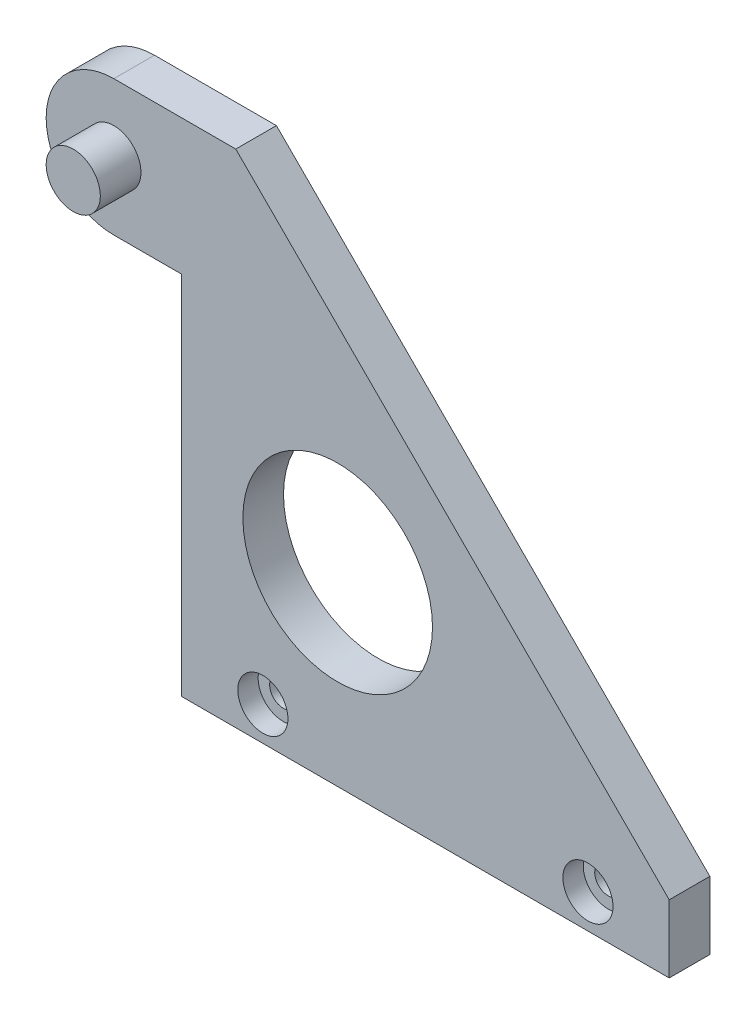
ISO-10303-21;
HEADER;
FILE_DESCRIPTION(('STEP AP214'),'2;1');
FILE_NAME('part.step','',(''),(''),'','','');
FILE_SCHEMA(('AUTOMOTIVE_DESIGN { 1 0 10303 214 1 1 1 1 }'));
ENDSEC;
DATA;
#1=APPLICATION_CONTEXT('core data for automotive mechanical design processes');
#2=APPLICATION_PROTOCOL_DEFINITION('international standard','automotive_design',2000,#1);
#3=PRODUCT_CONTEXT('',#1,'mechanical');
#4=PRODUCT('Part','Part','',(#3));
#5=PRODUCT_RELATED_PRODUCT_CATEGORY('part','',(#4));
#6=PRODUCT_DEFINITION_FORMATION('','',#4);
#7=PRODUCT_DEFINITION_CONTEXT('part definition',#1,'design');
#8=PRODUCT_DEFINITION('design','',#6,#7);
#9=PRODUCT_DEFINITION_SHAPE('','',#8);
#10=(LENGTH_UNIT() NAMED_UNIT(*) SI_UNIT(.MILLI.,.METRE.));
#11=(NAMED_UNIT(*) PLANE_ANGLE_UNIT() SI_UNIT($,.RADIAN.));
#12=(NAMED_UNIT(*) SI_UNIT($,.STERADIAN.) SOLID_ANGLE_UNIT());
#13=UNCERTAINTY_MEASURE_WITH_UNIT(LENGTH_MEASURE(1.E-05),#10,'distance_accuracy_value','');
#14=(GEOMETRIC_REPRESENTATION_CONTEXT(3) GLOBAL_UNCERTAINTY_ASSIGNED_CONTEXT((#13)) GLOBAL_UNIT_ASSIGNED_CONTEXT((#10,
#11,#12)) REPRESENTATION_CONTEXT('',''));
#15=CARTESIAN_POINT('',(0.,0.,0.));
#16=DIRECTION('',(0.,0.,1.));
#17=DIRECTION('',(1.,0.,0.));
#18=AXIS2_PLACEMENT_3D('',#15,#16,#17);
#19=CARTESIAN_POINT('',(-12.,2.49999999999995,0.));
#20=DIRECTION('',(0.,0.,1.));
#21=DIRECTION('',(1.,0.,0.));
#22=AXIS2_PLACEMENT_3D('',#19,#20,#21);
#23=CYLINDRICAL_SURFACE('',#22,1.);
#24=CARTESIAN_POINT('',(-12.,2.49999999999995,0.));
#25=DIRECTION('',(0.,0.,1.));
#26=DIRECTION('',(-1.,0.,0.));
#27=AXIS2_PLACEMENT_3D('',#24,#25,#26);
#28=CIRCLE('',#27,1.);
#29=CARTESIAN_POINT('',(-13.,2.49999999999995,0.));
#30=VERTEX_POINT('',#29);
#31=EDGE_CURVE('E140',#30,#30,#28,.T.);
#32=ORIENTED_EDGE('',*,*,#31,.F.);
#33=EDGE_LOOP('',(#32));
#34=FACE_BOUND('',#33,.T.);
#35=CARTESIAN_POINT('',(-12.,2.49999999999995,1.5));
#36=DIRECTION('',(0.,0.,1.));
#37=DIRECTION('',(1.,0.,0.));
#38=AXIS2_PLACEMENT_3D('',#35,#36,#37);
#39=CIRCLE('',#38,1.);
#40=CARTESIAN_POINT('',(-11.,2.49999999999995,1.5));
#41=VERTEX_POINT('',#40);
#42=EDGE_CURVE('E46',#41,#41,#39,.F.);
#43=ORIENTED_EDGE('',*,*,#42,.F.);
#44=EDGE_LOOP('',(#43));
#45=FACE_BOUND('',#44,.T.);
#46=ADVANCED_FACE('F41',(#34,#45),#23,.F.);
#47=CARTESIAN_POINT('',(12.,2.49999999999995,0.));
#48=DIRECTION('',(0.,0.,1.));
#49=DIRECTION('',(1.,0.,0.));
#50=AXIS2_PLACEMENT_3D('',#47,#48,#49);
#51=CYLINDRICAL_SURFACE('',#50,1.);
#52=CARTESIAN_POINT('',(12.,2.49999999999995,0.));
#53=DIRECTION('',(0.,0.,1.));
#54=DIRECTION('',(1.,0.,0.));
#55=AXIS2_PLACEMENT_3D('',#52,#53,#54);
#56=CIRCLE('',#55,1.);
#57=CARTESIAN_POINT('',(13.,2.49999999999995,0.));
#58=VERTEX_POINT('',#57);
#59=EDGE_CURVE('E155',#58,#58,#56,.T.);
#60=ORIENTED_EDGE('',*,*,#59,.F.);
#61=EDGE_LOOP('',(#60));
#62=FACE_BOUND('',#61,.T.);
#63=CARTESIAN_POINT('',(12.,2.49999999999995,1.5));
#64=DIRECTION('',(0.,0.,1.));
#65=DIRECTION('',(1.,0.,0.));
#66=AXIS2_PLACEMENT_3D('',#63,#64,#65);
#67=CIRCLE('',#66,1.);
#68=CARTESIAN_POINT('',(13.,2.49999999999995,1.5));
#69=VERTEX_POINT('',#68);
#70=EDGE_CURVE('E133',#69,#69,#67,.F.);
#71=ORIENTED_EDGE('',*,*,#70,.F.);
#72=EDGE_LOOP('',(#71));
#73=FACE_BOUND('',#72,.T.);
#74=ADVANCED_FACE('F217',(#62,#73),#51,.F.);
#75=CARTESIAN_POINT('',(-23.,32.,0.));
#76=DIRECTION('',(0.,0.,-1.));
#77=DIRECTION('',(-1.,0.,0.));
#78=AXIS2_PLACEMENT_3D('',#75,#76,#77);
#79=CYLINDRICAL_SURFACE('',#78,5.);
#80=DIRECTION('',(0.,0.,-1.));
#81=VECTOR('',#80,1.);
#82=CARTESIAN_POINT('',(-23.,37.,3.));
#83=LINE('',#82,#81);
#84=CARTESIAN_POINT('',(-23.,37.,0.));
#85=VERTEX_POINT('',#84);
#86=CARTESIAN_POINT('',(-23.,37.,3.));
#87=VERTEX_POINT('',#86);
#88=EDGE_CURVE('E123',#85,#87,#83,.F.);
#89=ORIENTED_EDGE('',*,*,#88,.F.);
#90=CARTESIAN_POINT('',(-23.,32.,0.));
#91=DIRECTION('',(0.,0.,-1.));
#92=DIRECTION('',(-1.,0.,0.));
#93=AXIS2_PLACEMENT_3D('',#90,#91,#92);
#94=CIRCLE('',#93,5.);
#95=CARTESIAN_POINT('',(-23.,27.,0.));
#96=VERTEX_POINT('',#95);
#97=EDGE_CURVE('E51',#96,#85,#94,.T.);
#98=ORIENTED_EDGE('',*,*,#97,.F.);
#99=DIRECTION('',(0.,0.,-1.));
#100=VECTOR('',#99,1.);
#101=CARTESIAN_POINT('',(-23.,27.,3.));
#102=LINE('',#101,#100);
#103=CARTESIAN_POINT('',(-23.,27.,3.));
#104=VERTEX_POINT('',#103);
#105=EDGE_CURVE('E131',#104,#96,#102,.T.);
#106=ORIENTED_EDGE('',*,*,#105,.F.);
#107=CARTESIAN_POINT('',(-23.,32.,3.));
#108=DIRECTION('',(0.,0.,-1.));
#109=DIRECTION('',(-1.,0.,0.));
#110=AXIS2_PLACEMENT_3D('',#107,#108,#109);
#111=CIRCLE('',#110,5.);
#112=EDGE_CURVE('E11',#87,#104,#111,.F.);
#113=ORIENTED_EDGE('',*,*,#112,.F.);
#114=EDGE_LOOP('',(#89,#98,#106,#113));
#115=FACE_BOUND('',#114,.T.);
#116=ADVANCED_FACE('F44',(#115),#79,.T.);
#117=CARTESIAN_POINT('',(-28.,27.,3.));
#118=DIRECTION('',(0.,1.,0.));
#119=DIRECTION('',(-1.,0.,0.));
#120=AXIS2_PLACEMENT_3D('',#117,#118,#119);
#121=PLANE('',#120);
#122=DIRECTION('',(1.,0.,0.));
#123=VECTOR('',#122,1.);
#124=CARTESIAN_POINT('',(-28.,27.,3.));
#125=LINE('',#124,#123);
#126=CARTESIAN_POINT('',(-18.,27.,3.));
#127=VERTEX_POINT('',#126);
#128=EDGE_CURVE('E98',#104,#127,#125,.T.);
#129=ORIENTED_EDGE('',*,*,#128,.F.);
#130=ORIENTED_EDGE('',*,*,#105,.T.);
#131=DIRECTION('',(1.,0.,0.));
#132=VECTOR('',#131,1.);
#133=CARTESIAN_POINT('',(-28.,27.,0.));
#134=LINE('',#133,#132);
#135=CARTESIAN_POINT('',(-18.,27.,0.));
#136=VERTEX_POINT('',#135);
#137=EDGE_CURVE('E118',#96,#136,#134,.T.);
#138=ORIENTED_EDGE('',*,*,#137,.T.);
#139=DIRECTION('',(0.,0.,-1.));
#140=VECTOR('',#139,1.);
#141=CARTESIAN_POINT('',(-18.,27.,3.));
#142=LINE('',#141,#140);
#143=EDGE_CURVE('E110',#127,#136,#142,.T.);
#144=ORIENTED_EDGE('',*,*,#143,.F.);
#145=EDGE_LOOP('',(#129,#130,#138,#144));
#146=FACE_BOUND('',#145,.T.);
#147=ADVANCED_FACE('F116',(#146),#121,.F.);
#148=CARTESIAN_POINT('',(-18.,27.,3.));
#149=DIRECTION('',(1.,0.,0.));
#150=DIRECTION('',(0.,1.,0.));
#151=AXIS2_PLACEMENT_3D('',#148,#149,#150);
#152=PLANE('',#151);
#153=DIRECTION('',(0.,-1.,0.));
#154=VECTOR('',#153,1.);
#155=CARTESIAN_POINT('',(-18.,27.,0.));
#156=LINE('',#155,#154);
#157=CARTESIAN_POINT('',(-18.,0.,0.));
#158=VERTEX_POINT('',#157);
#159=EDGE_CURVE('E173',#136,#158,#156,.T.);
#160=ORIENTED_EDGE('',*,*,#159,.T.);
#161=DIRECTION('',(0.,0.,-1.));
#162=VECTOR('',#161,1.);
#163=CARTESIAN_POINT('',(-18.,0.,3.));
#164=LINE('',#163,#162);
#165=CARTESIAN_POINT('',(-18.,0.,3.));
#166=VERTEX_POINT('',#165);
#167=EDGE_CURVE('E112',#166,#158,#164,.T.);
#168=ORIENTED_EDGE('',*,*,#167,.F.);
#169=DIRECTION('',(0.,-1.,0.));
#170=VECTOR('',#169,1.);
#171=CARTESIAN_POINT('',(-18.,27.,3.));
#172=LINE('',#171,#170);
#173=EDGE_CURVE('E101',#127,#166,#172,.T.);
#174=ORIENTED_EDGE('',*,*,#173,.F.);
#175=ORIENTED_EDGE('',*,*,#143,.T.);
#176=EDGE_LOOP('',(#160,#168,#174,#175));
#177=FACE_BOUND('',#176,.T.);
#178=ADVANCED_FACE('F109',(#177),#152,.F.);
#179=CARTESIAN_POINT('',(-18.,0.,3.));
#180=DIRECTION('',(0.,1.,0.));
#181=DIRECTION('',(-1.,0.,0.));
#182=AXIS2_PLACEMENT_3D('',#179,#180,#181);
#183=PLANE('',#182);
#184=DIRECTION('',(1.,0.,0.));
#185=VECTOR('',#184,1.);
#186=CARTESIAN_POINT('',(-18.,0.,0.));
#187=LINE('',#186,#185);
#188=CARTESIAN_POINT('',(18.,0.,0.));
#189=VERTEX_POINT('',#188);
#190=EDGE_CURVE('E175',#158,#189,#187,.T.);
#191=ORIENTED_EDGE('',*,*,#190,.T.);
#192=DIRECTION('',(0.,0.,-1.));
#193=VECTOR('',#192,1.);
#194=CARTESIAN_POINT('',(18.,0.,3.));
#195=LINE('',#194,#193);
#196=CARTESIAN_POINT('',(18.,0.,3.));
#197=VERTEX_POINT('',#196);
#198=EDGE_CURVE('E125',#197,#189,#195,.T.);
#199=ORIENTED_EDGE('',*,*,#198,.F.);
#200=DIRECTION('',(1.,0.,0.));
#201=VECTOR('',#200,1.);
#202=CARTESIAN_POINT('',(-18.,0.,3.));
#203=LINE('',#202,#201);
#204=EDGE_CURVE('E114',#166,#197,#203,.T.);
#205=ORIENTED_EDGE('',*,*,#204,.F.);
#206=ORIENTED_EDGE('',*,*,#167,.T.);
#207=EDGE_LOOP('',(#191,#199,#205,#206));
#208=FACE_BOUND('',#207,.T.);
#209=ADVANCED_FACE('F207',(#208),#183,.F.);
#210=CARTESIAN_POINT('',(18.,0.,3.));
#211=DIRECTION('',(-1.,0.,0.));
#212=DIRECTION('',(0.,0.,1.));
#213=AXIS2_PLACEMENT_3D('',#210,#211,#212);
#214=PLANE('',#213);
#215=DIRECTION('',(0.,1.,0.));
#216=VECTOR('',#215,1.);
#217=CARTESIAN_POINT('',(18.,0.,0.));
#218=LINE('',#217,#216);
#219=CARTESIAN_POINT('',(18.,5.00000000000001,0.));
#220=VERTEX_POINT('',#219);
#221=EDGE_CURVE('E177',#189,#220,#218,.T.);
#222=ORIENTED_EDGE('',*,*,#221,.T.);
#223=DIRECTION('',(0.,0.,-1.));
#224=VECTOR('',#223,1.);
#225=CARTESIAN_POINT('',(18.,5.00000000000001,3.));
#226=LINE('',#225,#224);
#227=CARTESIAN_POINT('',(18.,5.00000000000001,3.));
#228=VERTEX_POINT('',#227);
#229=EDGE_CURVE('E185',#228,#220,#226,.T.);
#230=ORIENTED_EDGE('',*,*,#229,.F.);
#231=DIRECTION('',(0.,1.,0.));
#232=VECTOR('',#231,1.);
#233=CARTESIAN_POINT('',(18.,0.,3.));
#234=LINE('',#233,#232);
#235=EDGE_CURVE('E165',#197,#228,#234,.T.);
#236=ORIENTED_EDGE('',*,*,#235,.F.);
#237=ORIENTED_EDGE('',*,*,#198,.T.);
#238=EDGE_LOOP('',(#222,#230,#236,#237));
#239=FACE_BOUND('',#238,.T.);
#240=ADVANCED_FACE('F192',(#239),#214,.F.);
#241=CARTESIAN_POINT('',(18.,5.00000000000001,3.));
#242=DIRECTION('',(-0.707106781186548,-0.707106781186547,0.));
#243=DIRECTION('',(0.707106781186547,-0.707106781186548,0.));
#244=AXIS2_PLACEMENT_3D('',#241,#242,#243);
#245=PLANE('',#244);
#246=DIRECTION('',(-0.707106781186547,0.707106781186548,0.));
#247=VECTOR('',#246,1.);
#248=CARTESIAN_POINT('',(18.,5.00000000000001,0.));
#249=LINE('',#248,#247);
#250=CARTESIAN_POINT('',(-13.9999999999999,37.,0.));
#251=VERTEX_POINT('',#250);
#252=EDGE_CURVE('E179',#220,#251,#249,.T.);
#253=ORIENTED_EDGE('',*,*,#252,.T.);
#254=DIRECTION('',(0.,0.,-1.));
#255=VECTOR('',#254,1.);
#256=CARTESIAN_POINT('',(-13.9999999999999,37.,3.));
#257=LINE('',#256,#255);
#258=CARTESIAN_POINT('',(-13.9999999999999,37.,3.));
#259=VERTEX_POINT('',#258);
#260=EDGE_CURVE('E171',#259,#251,#257,.T.);
#261=ORIENTED_EDGE('',*,*,#260,.F.);
#262=DIRECTION('',(-0.707106781186547,0.707106781186548,0.));
#263=VECTOR('',#262,1.);
#264=CARTESIAN_POINT('',(18.,5.00000000000001,3.));
#265=LINE('',#264,#263);
#266=EDGE_CURVE('E167',#228,#259,#265,.T.);
#267=ORIENTED_EDGE('',*,*,#266,.F.);
#268=ORIENTED_EDGE('',*,*,#229,.T.);
#269=EDGE_LOOP('',(#253,#261,#267,#268));
#270=FACE_BOUND('',#269,.T.);
#271=ADVANCED_FACE('F202',(#270),#245,.F.);
#272=CARTESIAN_POINT('',(-13.9999999999999,37.,3.));
#273=DIRECTION('',(0.,-1.,0.));
#274=DIRECTION('',(1.,0.,0.));
#275=AXIS2_PLACEMENT_3D('',#272,#273,#274);
#276=PLANE('',#275);
#277=DIRECTION('',(-1.,0.,0.));
#278=VECTOR('',#277,1.);
#279=CARTESIAN_POINT('',(-13.9999999999999,37.,0.));
#280=LINE('',#279,#278);
#281=EDGE_CURVE('E105',#251,#85,#280,.T.);
#282=ORIENTED_EDGE('',*,*,#281,.T.);
#283=ORIENTED_EDGE('',*,*,#88,.T.);
#284=DIRECTION('',(-1.,0.,0.));
#285=VECTOR('',#284,1.);
#286=CARTESIAN_POINT('',(-13.9999999999999,37.,3.));
#287=LINE('',#286,#285);
#288=EDGE_CURVE('E169',#259,#87,#287,.T.);
#289=ORIENTED_EDGE('',*,*,#288,.F.);
#290=ORIENTED_EDGE('',*,*,#260,.T.);
#291=EDGE_LOOP('',(#282,#283,#289,#290));
#292=FACE_BOUND('',#291,.T.);
#293=ADVANCED_FACE('F206',(#292),#276,.F.);
#294=CARTESIAN_POINT('',(0.,0.,3.));
#295=DIRECTION('',(0.,0.,-1.));
#296=DIRECTION('',(-1.,0.,0.));
#297=AXIS2_PLACEMENT_3D('',#294,#295,#296);
#298=PLANE('',#297);
#299=CARTESIAN_POINT('',(-12.,2.49999999999995,3.));
#300=DIRECTION('',(0.,0.,1.));
#301=DIRECTION('',(1.,0.,0.));
#302=AXIS2_PLACEMENT_3D('',#299,#300,#301);
#303=CIRCLE('',#302,1.85);
#304=CARTESIAN_POINT('',(-10.15,2.49999999999995,3.));
#305=VERTEX_POINT('',#304);
#306=EDGE_CURVE('E150',#305,#305,#303,.T.);
#307=ORIENTED_EDGE('',*,*,#306,.F.);
#308=EDGE_LOOP('',(#307));
#309=FACE_BOUND('',#308,.T.);
#310=CARTESIAN_POINT('',(12.,2.49999999999995,3.));
#311=DIRECTION('',(0.,0.,1.));
#312=DIRECTION('',(1.,0.,0.));
#313=AXIS2_PLACEMENT_3D('',#310,#311,#312);
#314=CIRCLE('',#313,1.85);
#315=CARTESIAN_POINT('',(13.85,2.49999999999995,3.));
#316=VERTEX_POINT('',#315);
#317=EDGE_CURVE('E143',#316,#316,#314,.T.);
#318=ORIENTED_EDGE('',*,*,#317,.F.);
#319=EDGE_LOOP('',(#318));
#320=FACE_BOUND('',#319,.T.);
#321=CARTESIAN_POINT('',(-23.,32.,3.));
#322=DIRECTION('',(0.,0.,-1.));
#323=DIRECTION('',(-1.,0.,0.));
#324=AXIS2_PLACEMENT_3D('',#321,#322,#323);
#325=CIRCLE('',#324,2.);
#326=CARTESIAN_POINT('',(-25.,32.,3.));
#327=VERTEX_POINT('',#326);
#328=EDGE_CURVE('E120',#327,#327,#325,.F.);
#329=ORIENTED_EDGE('',*,*,#328,.F.);
#330=EDGE_LOOP('',(#329));
#331=FACE_BOUND('',#330,.T.);
#332=CARTESIAN_POINT('',(-6.47635753390574,13.6875392105491,3.));
#333=DIRECTION('',(0.,0.,1.));
#334=DIRECTION('',(1.,0.,0.));
#335=AXIS2_PLACEMENT_3D('',#332,#333,#334);
#336=CIRCLE('',#335,7.);
#337=CARTESIAN_POINT('',(0.523642466094258,13.6875392105491,3.));
#338=VERTEX_POINT('',#337);
#339=EDGE_CURVE('E158',#338,#338,#336,.T.);
#340=ORIENTED_EDGE('',*,*,#339,.F.);
#341=EDGE_LOOP('',(#340));
#342=FACE_BOUND('',#341,.T.);
#343=ORIENTED_EDGE('',*,*,#288,.T.);
#344=ORIENTED_EDGE('',*,*,#112,.T.);
#345=ORIENTED_EDGE('',*,*,#128,.T.);
#346=ORIENTED_EDGE('',*,*,#173,.T.);
#347=ORIENTED_EDGE('',*,*,#204,.T.);
#348=ORIENTED_EDGE('',*,*,#235,.T.);
#349=ORIENTED_EDGE('',*,*,#266,.T.);
#350=EDGE_LOOP('',(#343,#344,#345,#346,#347,#348,#349));
#351=FACE_BOUND('',#350,.T.);
#352=ADVANCED_FACE('F100',(#309,#320,#331,#342,#351),#298,.F.);
#353=CARTESIAN_POINT('',(0.,0.,0.));
#354=DIRECTION('',(0.,0.,-1.));
#355=DIRECTION('',(-1.,0.,0.));
#356=AXIS2_PLACEMENT_3D('',#353,#354,#355);
#357=PLANE('',#356);
#358=ORIENTED_EDGE('',*,*,#31,.T.);
#359=EDGE_LOOP('',(#358));
#360=FACE_BOUND('',#359,.T.);
#361=ORIENTED_EDGE('',*,*,#59,.T.);
#362=EDGE_LOOP('',(#361));
#363=FACE_BOUND('',#362,.T.);
#364=CARTESIAN_POINT('',(-6.47635753390574,13.6875392105491,0.));
#365=DIRECTION('',(0.,0.,1.));
#366=DIRECTION('',(1.,0.,0.));
#367=AXIS2_PLACEMENT_3D('',#364,#365,#366);
#368=CIRCLE('',#367,7.);
#369=CARTESIAN_POINT('',(0.523642466094258,13.6875392105491,0.));
#370=VERTEX_POINT('',#369);
#371=EDGE_CURVE('E159',#370,#370,#368,.T.);
#372=ORIENTED_EDGE('',*,*,#371,.T.);
#373=EDGE_LOOP('',(#372));
#374=FACE_BOUND('',#373,.T.);
#375=ORIENTED_EDGE('',*,*,#137,.F.);
#376=ORIENTED_EDGE('',*,*,#97,.T.);
#377=ORIENTED_EDGE('',*,*,#281,.F.);
#378=ORIENTED_EDGE('',*,*,#252,.F.);
#379=ORIENTED_EDGE('',*,*,#221,.F.);
#380=ORIENTED_EDGE('',*,*,#190,.F.);
#381=ORIENTED_EDGE('',*,*,#159,.F.);
#382=EDGE_LOOP('',(#375,#376,#377,#378,#379,#380,#381));
#383=FACE_BOUND('',#382,.T.);
#384=ADVANCED_FACE('F198',(#360,#363,#374,#383),#357,.T.);
#385=CARTESIAN_POINT('',(-6.47635753390574,13.6875392105491,0.));
#386=DIRECTION('',(0.,0.,1.));
#387=DIRECTION('',(1.,0.,0.));
#388=AXIS2_PLACEMENT_3D('',#385,#386,#387);
#389=CYLINDRICAL_SURFACE('',#388,7.);
#390=ORIENTED_EDGE('',*,*,#371,.F.);
#391=EDGE_LOOP('',(#390));
#392=FACE_BOUND('',#391,.T.);
#393=ORIENTED_EDGE('',*,*,#339,.T.);
#394=EDGE_LOOP('',(#393));
#395=FACE_BOUND('',#394,.T.);
#396=ADVANCED_FACE('F232',(#392,#395),#389,.F.);
#397=CARTESIAN_POINT('',(-23.,32.,6.));
#398=DIRECTION('',(0.,0.,-1.));
#399=DIRECTION('',(-1.,0.,0.));
#400=AXIS2_PLACEMENT_3D('',#397,#398,#399);
#401=CYLINDRICAL_SURFACE('',#400,2.);
#402=CARTESIAN_POINT('',(-23.,32.,6.));
#403=DIRECTION('',(0.,0.,1.));
#404=DIRECTION('',(1.,0.,0.));
#405=AXIS2_PLACEMENT_3D('',#402,#403,#404);
#406=CIRCLE('',#405,2.);
#407=CARTESIAN_POINT('',(-21.,32.,6.));
#408=VERTEX_POINT('',#407);
#409=EDGE_CURVE('E135',#408,#408,#406,.T.);
#410=ORIENTED_EDGE('',*,*,#409,.F.);
#411=EDGE_LOOP('',(#410));
#412=FACE_BOUND('',#411,.T.);
#413=ORIENTED_EDGE('',*,*,#328,.T.);
#414=EDGE_LOOP('',(#413));
#415=FACE_BOUND('',#414,.T.);
#416=ADVANCED_FACE('F229',(#412,#415),#401,.T.);
#417=CARTESIAN_POINT('',(-23.,32.,6.));
#418=DIRECTION('',(0.,0.,1.));
#419=DIRECTION('',(1.,0.,0.));
#420=AXIS2_PLACEMENT_3D('',#417,#418,#419);
#421=PLANE('',#420);
#422=ORIENTED_EDGE('',*,*,#409,.T.);
#423=EDGE_LOOP('',(#422));
#424=FACE_BOUND('',#423,.T.);
#425=ADVANCED_FACE('F260',(#424),#421,.T.);
#426=CARTESIAN_POINT('',(12.,2.49999999999995,1.5));
#427=DIRECTION('',(0.,0.,1.));
#428=DIRECTION('',(1.,0.,0.));
#429=AXIS2_PLACEMENT_3D('',#426,#427,#428);
#430=PLANE('',#429);
#431=CARTESIAN_POINT('',(12.,2.49999999999995,1.5));
#432=DIRECTION('',(0.,0.,1.));
#433=DIRECTION('',(1.,0.,0.));
#434=AXIS2_PLACEMENT_3D('',#431,#432,#433);
#435=CIRCLE('',#434,1.85);
#436=CARTESIAN_POINT('',(13.85,2.49999999999995,1.5));
#437=VERTEX_POINT('',#436);
#438=EDGE_CURVE('E136',#437,#437,#435,.T.);
#439=ORIENTED_EDGE('',*,*,#438,.T.);
#440=EDGE_LOOP('',(#439));
#441=FACE_BOUND('',#440,.T.);
#442=ORIENTED_EDGE('',*,*,#70,.T.);
#443=EDGE_LOOP('',(#442));
#444=FACE_BOUND('',#443,.T.);
#445=ADVANCED_FACE('F267',(#441,#444),#430,.T.);
#446=CARTESIAN_POINT('',(12.,2.49999999999995,1.5));
#447=DIRECTION('',(0.,0.,1.));
#448=DIRECTION('',(1.,0.,0.));
#449=AXIS2_PLACEMENT_3D('',#446,#447,#448);
#450=CYLINDRICAL_SURFACE('',#449,1.85);
#451=ORIENTED_EDGE('',*,*,#438,.F.);
#452=EDGE_LOOP('',(#451));
#453=FACE_BOUND('',#452,.T.);
#454=ORIENTED_EDGE('',*,*,#317,.T.);
#455=EDGE_LOOP('',(#454));
#456=FACE_BOUND('',#455,.T.);
#457=ADVANCED_FACE('F297',(#453,#456),#450,.F.);
#458=CARTESIAN_POINT('',(-12.,2.49999999999995,1.5));
#459=DIRECTION('',(0.,0.,1.));
#460=DIRECTION('',(1.,0.,0.));
#461=AXIS2_PLACEMENT_3D('',#458,#459,#460);
#462=PLANE('',#461);
#463=CARTESIAN_POINT('',(-12.,2.49999999999995,1.5));
#464=DIRECTION('',(0.,0.,1.));
#465=DIRECTION('',(1.,0.,0.));
#466=AXIS2_PLACEMENT_3D('',#463,#464,#465);
#467=CIRCLE('',#466,1.85);
#468=CARTESIAN_POINT('',(-10.15,2.49999999999995,1.5));
#469=VERTEX_POINT('',#468);
#470=EDGE_CURVE('E326',#469,#469,#467,.T.);
#471=ORIENTED_EDGE('',*,*,#470,.T.);
#472=EDGE_LOOP('',(#471));
#473=FACE_BOUND('',#472,.T.);
#474=ORIENTED_EDGE('',*,*,#42,.T.);
#475=EDGE_LOOP('',(#474));
#476=FACE_BOUND('',#475,.T.);
#477=ADVANCED_FACE('F304',(#473,#476),#462,.T.);
#478=CARTESIAN_POINT('',(-12.,2.49999999999995,1.5));
#479=DIRECTION('',(0.,0.,1.));
#480=DIRECTION('',(1.,0.,0.));
#481=AXIS2_PLACEMENT_3D('',#478,#479,#480);
#482=CYLINDRICAL_SURFACE('',#481,1.85);
#483=ORIENTED_EDGE('',*,*,#470,.F.);
#484=EDGE_LOOP('',(#483));
#485=FACE_BOUND('',#484,.T.);
#486=ORIENTED_EDGE('',*,*,#306,.T.);
#487=EDGE_LOOP('',(#486));
#488=FACE_BOUND('',#487,.T.);
#489=ADVANCED_FACE('F312',(#485,#488),#482,.F.);
#490=CLOSED_SHELL('',(#46,#74,#116,#147,#178,#209,#240,#271,#293,#352,#384,#396,#416,#425,#445,
#457,#477,#489));
#491=MANIFOLD_SOLID_BREP('B2',#490);
#492=ADVANCED_BREP_SHAPE_REPRESENTATION('',(#18,#491),#14);
#493=SHAPE_DEFINITION_REPRESENTATION(#9,#492);
ENDSEC;
END-ISO-10303-21;
